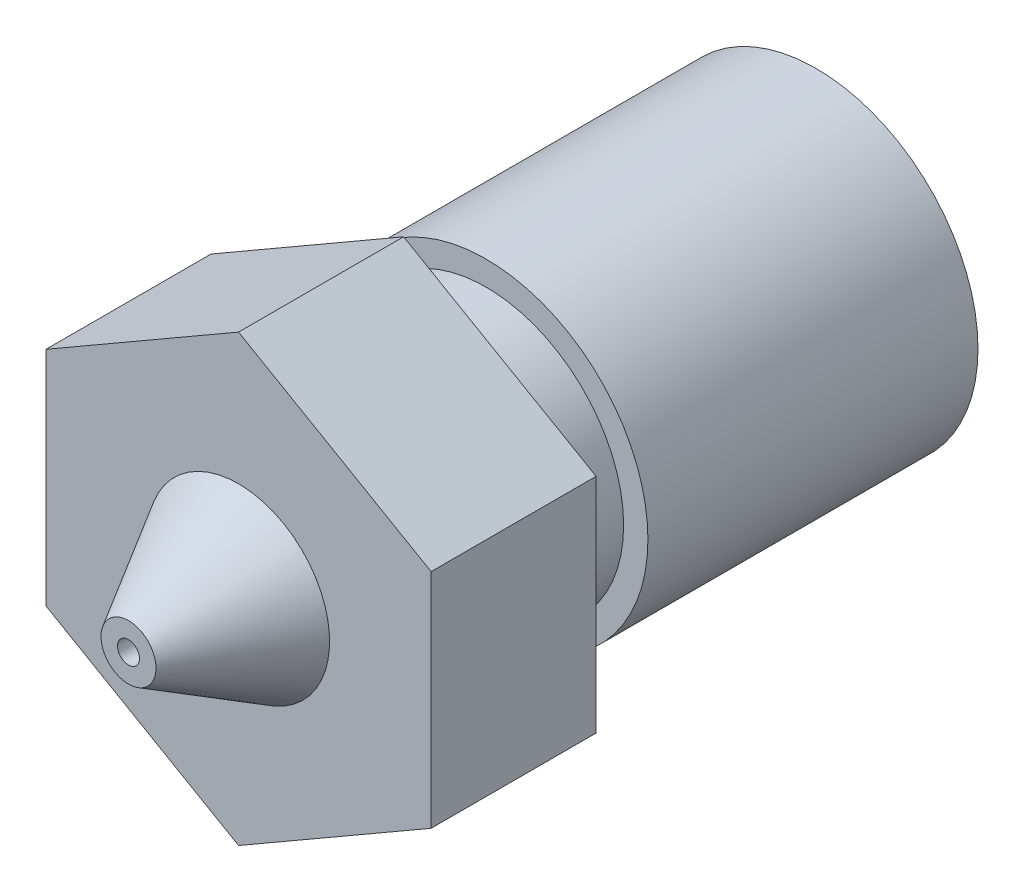
ISO-10303-21;
HEADER;
FILE_DESCRIPTION(('STEP AP214'),'2;1');
FILE_NAME('part.step','',(''),(''),'','','');
FILE_SCHEMA(('AUTOMOTIVE_DESIGN { 1 0 10303 214 1 1 1 1 }'));
ENDSEC;
DATA;
#1=APPLICATION_CONTEXT('core data for automotive mechanical design processes');
#2=APPLICATION_PROTOCOL_DEFINITION('international standard','automotive_design',2000,#1);
#3=PRODUCT_CONTEXT('',#1,'mechanical');
#4=PRODUCT('Part','Part','',(#3));
#5=PRODUCT_RELATED_PRODUCT_CATEGORY('part','',(#4));
#6=PRODUCT_DEFINITION_FORMATION('','',#4);
#7=PRODUCT_DEFINITION_CONTEXT('part definition',#1,'design');
#8=PRODUCT_DEFINITION('design','',#6,#7);
#9=PRODUCT_DEFINITION_SHAPE('','',#8);
#10=(LENGTH_UNIT() NAMED_UNIT(*) SI_UNIT(.MILLI.,.METRE.));
#11=(NAMED_UNIT(*) PLANE_ANGLE_UNIT() SI_UNIT($,.RADIAN.));
#12=(NAMED_UNIT(*) SI_UNIT($,.STERADIAN.) SOLID_ANGLE_UNIT());
#13=UNCERTAINTY_MEASURE_WITH_UNIT(LENGTH_MEASURE(1.E-05),#10,'distance_accuracy_value','');
#14=(GEOMETRIC_REPRESENTATION_CONTEXT(3) GLOBAL_UNCERTAINTY_ASSIGNED_CONTEXT((#13)) GLOBAL_UNIT_ASSIGNED_CONTEXT((#10,
#11,#12)) REPRESENTATION_CONTEXT('',''));
#15=CARTESIAN_POINT('',(0.,0.,0.));
#16=DIRECTION('',(0.,0.,1.));
#17=DIRECTION('',(1.,0.,0.));
#18=AXIS2_PLACEMENT_3D('',#15,#16,#17);
#19=CARTESIAN_POINT('',(0.,0.,10.4999999999791));
#20=DIRECTION('',(0.,0.,-1.));
#21=DIRECTION('',(-1.,0.,0.));
#22=AXIS2_PLACEMENT_3D('',#19,#20,#21);
#23=CONICAL_SURFACE('',#22,1.65470053838135,0.523598775589144);
#24=CARTESIAN_POINT('',(0.,0.,12.5000000000455));
#25=DIRECTION('',(0.,0.,-1.));
#26=DIRECTION('',(-1.,0.,0.));
#27=AXIS2_PLACEMENT_3D('',#24,#25,#26);
#28=CIRCLE('',#27,0.499999999988176);
#29=CARTESIAN_POINT('',(-0.499999999988176,0.,12.5000000000455));
#30=VERTEX_POINT('',#29);
#31=EDGE_CURVE('E20',#30,#30,#28,.F.);
#32=CARTESIAN_POINT('',(0.,0.,10.4999999999791));
#33=DIRECTION('',(0.,0.,-1.));
#34=DIRECTION('',(-1.,0.,0.));
#35=AXIS2_PLACEMENT_3D('',#32,#33,#34);
#36=CIRCLE('',#35,1.65470053838135);
#37=CARTESIAN_POINT('',(-1.65470053838135,0.,10.4999999999791));
#38=VERTEX_POINT('',#37);
#39=EDGE_CURVE('E114',#38,#38,#36,.T.);
#40=CARTESIAN_POINT('',(-0.499999999988176,0.,12.5000000000455));
#41=CARTESIAN_POINT('',(-0.512028130596438,0.,12.4791666667114));
#42=CARTESIAN_POINT('',(-0.5240562612047,0.,12.4583333333774));
#43=CARTESIAN_POINT('',(-0.548112522421225,0.,12.4166666667094));
#44=CARTESIAN_POINT('',(-0.560140653029487,0.,12.3958333333754));
#45=CARTESIAN_POINT('',(-0.584196914246011,0.,12.3541666667073));
#46=CARTESIAN_POINT('',(-0.596225044854274,0.,12.3333333333733));
#47=CARTESIAN_POINT('',(-0.620281306070798,0.,12.2916666667052));
#48=CARTESIAN_POINT('',(-0.63230943667906,0.,12.2708333333712));
#49=CARTESIAN_POINT('',(-0.656365697895585,0.,12.2291666667032));
#50=CARTESIAN_POINT('',(-0.668393828503847,0.,12.2083333333691));
#51=CARTESIAN_POINT('',(-0.692450089720371,0.,12.1666666667011));
#52=CARTESIAN_POINT('',(-0.704478220328633,0.,12.1458333333671));
#53=CARTESIAN_POINT('',(-0.728534481545158,0.,12.104166666699));
#54=CARTESIAN_POINT('',(-0.74056261215342,0.,12.083333333365));
#55=CARTESIAN_POINT('',(-0.764618873369945,0.,12.0416666666969));
#56=CARTESIAN_POINT('',(-0.776647003978207,0.,12.0208333333629));
#57=CARTESIAN_POINT('',(-0.800703265194731,0.,11.9791666666949));
#58=CARTESIAN_POINT('',(-0.812731395802993,0.,11.9583333333608));
#59=CARTESIAN_POINT('',(-0.836787657019518,0.,11.9166666666928));
#60=CARTESIAN_POINT('',(-0.84881578762778,0.,11.8958333333588));
#61=CARTESIAN_POINT('',(-0.872872048844304,0.,11.8541666666907));
#62=CARTESIAN_POINT('',(-0.884900179452567,0.,11.8333333333567));
#63=CARTESIAN_POINT('',(-0.908956440669091,0.,11.7916666666886));
#64=CARTESIAN_POINT('',(-0.920984571277353,0.,11.7708333333546));
#65=CARTESIAN_POINT('',(-0.945040832493878,0.,11.7291666666866));
#66=CARTESIAN_POINT('',(-0.95706896310214,0.,11.7083333333525));
#67=CARTESIAN_POINT('',(-0.981125224318664,0.,11.6666666666845));
#68=CARTESIAN_POINT('',(-0.993153354926927,0.,11.6458333333505));
#69=CARTESIAN_POINT('',(-1.01720961614345,0.,11.6041666666824));
#70=CARTESIAN_POINT('',(-1.02923774675171,0.,11.5833333333484));
#71=CARTESIAN_POINT('',(-1.05329400796824,0.,11.5416666666803));
#72=CARTESIAN_POINT('',(-1.0653221385765,0.,11.5208333333463));
#73=CARTESIAN_POINT('',(-1.08937839979302,0.,11.4791666666783));
#74=CARTESIAN_POINT('',(-1.10140653040129,0.,11.4583333333442));
#75=CARTESIAN_POINT('',(-1.12546279161781,0.,11.4166666666762));
#76=CARTESIAN_POINT('',(-1.13749092222607,0.,11.3958333333422));
#77=CARTESIAN_POINT('',(-1.1615471834426,0.,11.3541666666741));
#78=CARTESIAN_POINT('',(-1.17357531405086,0.,11.3333333333401));
#79=CARTESIAN_POINT('',(-1.19763157526738,0.,11.291666666672));
#80=CARTESIAN_POINT('',(-1.20965970587565,0.,11.270833333338));
#81=CARTESIAN_POINT('',(-1.23371596709217,0.,11.22916666667));
#82=CARTESIAN_POINT('',(-1.24574409770043,0.,11.2083333333359));
#83=CARTESIAN_POINT('',(-1.26980035891696,0.,11.1666666666679));
#84=CARTESIAN_POINT('',(-1.28182848952522,0.,11.1458333333339));
#85=CARTESIAN_POINT('',(-1.30588475074174,0.,11.1041666666658));
#86=CARTESIAN_POINT('',(-1.31791288135001,0.,11.0833333333318));
#87=CARTESIAN_POINT('',(-1.34196914256653,0.,11.0416666666637));
#88=CARTESIAN_POINT('',(-1.35399727317479,0.,11.0208333333297));
#89=CARTESIAN_POINT('',(-1.37805353439132,0.,10.9791666666617));
#90=CARTESIAN_POINT('',(-1.39008166499958,0.,10.9583333333276));
#91=CARTESIAN_POINT('',(-1.4141379262161,0.,10.9166666666596));
#92=CARTESIAN_POINT('',(-1.42616605682437,0.,10.8958333333256));
#93=CARTESIAN_POINT('',(-1.45022231804089,0.,10.8541666666575));
#94=CARTESIAN_POINT('',(-1.46225044864915,0.,10.8333333333235));
#95=CARTESIAN_POINT('',(-1.48630670986568,0.,10.7916666666554));
#96=CARTESIAN_POINT('',(-1.49833484047394,0.,10.7708333333214));
#97=CARTESIAN_POINT('',(-1.52239110169046,0.,10.7291666666534));
#98=CARTESIAN_POINT('',(-1.53441923229873,0.,10.7083333333193));
#99=CARTESIAN_POINT('',(-1.55847549351525,0.,10.6666666666513));
#100=CARTESIAN_POINT('',(-1.57050362412351,0.,10.6458333333173));
#101=CARTESIAN_POINT('',(-1.59455988534004,0.,10.6041666666492));
#102=CARTESIAN_POINT('',(-1.6065880159483,0.,10.5833333333152));
#103=CARTESIAN_POINT('',(-1.63064427716482,0.,10.5416666666471));
#104=CARTESIAN_POINT('',(-1.64267240777309,0.,10.5208333333131));
#105=CARTESIAN_POINT('',(-1.65470053838135,0.,10.4999999999791));
#106=B_SPLINE_CURVE_WITH_KNOTS('',3,(#40,#41,#42,#43,#44,#45,#46,#47,#48,#49,#50,#51,#52,#53,
#54,#55,#56,#57,#58,#59,#60,#61,#62,#63,#64,#65,#66,#67,#68,#69,#70,#71,#72,#73,#74,#75,#76,#77,
#78,#79,#80,#81,#82,#83,#84,#85,#86,#87,#88,#89,#90,#91,#92,#93,#94,#95,#96,#97,#98,#99,#100,
#101,#102,#103,#104,#105),.UNSPECIFIED.,.F.,.F.,(4,2,2,2,2,2,2,2,2,2,2,2,2,2,2,2,2,2,2,2,2,2,2,
2,2,2,2,2,2,2,2,2,4),(0.,0.0721687836507175,0.144337567301435,0.216506350952153,
0.28867513460287,0.360843918253588,0.433012701904305,0.505181485555023,0.57735026920574,
0.649519052856458,0.721687836507175,0.793856620157893,0.86602540380861,0.938194187459328,
1.01036297111005,1.08253175476076,1.15470053841148,1.2268693220622,1.29903810571292,
1.37120688936363,1.44337567301435,1.51554445666507,1.58771324031579,1.6598820239665,
1.73205080761722,1.80421959126794,1.87638837491866,1.94855715856937,2.02072594222009,
2.09289472587081,2.16506350952153,2.23723229317224,2.30940107682296),.UNSPECIFIED.);
#107=EDGE_CURVE('BSEAM17',#30,#38,#106,.T.);
#108=ORIENTED_EDGE('',*,*,#31,.F.);
#109=ORIENTED_EDGE('',*,*,#39,.F.);
#110=ORIENTED_EDGE('',*,*,#107,.T.);
#111=ORIENTED_EDGE('',*,*,#107,.F.);
#112=EDGE_LOOP('',(#108,#110,#109,#111));
#113=FACE_BOUND('',#112,.T.);
#114=ADVANCED_FACE('F17',(#113),#23,.T.);
#115=CARTESIAN_POINT('',(0.,0.,12.5));
#116=DIRECTION('',(0.,0.,1.));
#117=DIRECTION('',(1.,0.,0.));
#118=AXIS2_PLACEMENT_3D('',#115,#116,#117);
#119=PLANE('',#118);
#120=CARTESIAN_POINT('',(0.,0.,12.5));
#121=DIRECTION('',(0.,0.,1.));
#122=DIRECTION('',(1.,0.,0.));
#123=AXIS2_PLACEMENT_3D('',#120,#121,#122);
#124=CIRCLE('',#123,0.2);
#125=CARTESIAN_POINT('',(0.2,0.,12.5));
#126=VERTEX_POINT('',#125);
#127=EDGE_CURVE('E78',#126,#126,#124,.F.);
#128=ORIENTED_EDGE('',*,*,#127,.T.);
#129=EDGE_LOOP('',(#128));
#130=FACE_BOUND('',#129,.T.);
#131=ORIENTED_EDGE('',*,*,#31,.T.);
#132=EDGE_LOOP('',(#131));
#133=FACE_BOUND('',#132,.T.);
#134=ADVANCED_FACE('F121',(#130,#133),#119,.T.);
#135=CARTESIAN_POINT('',(0.,0.,10.5));
#136=DIRECTION('',(0.,0.,1.));
#137=DIRECTION('',(1.,0.,0.));
#138=AXIS2_PLACEMENT_3D('',#135,#136,#137);
#139=PLANE('',#138);
#140=ORIENTED_EDGE('',*,*,#39,.T.);
#141=EDGE_LOOP('',(#140));
#142=FACE_BOUND('',#141,.T.);
#143=DIRECTION('',(0.,1.,0.));
#144=VECTOR('',#143,1.);
#145=CARTESIAN_POINT('',(3.5,-2.02072594216369,10.5));
#146=LINE('',#145,#144);
#147=CARTESIAN_POINT('',(3.5,2.02072594216369,10.5));
#148=VERTEX_POINT('',#147);
#149=CARTESIAN_POINT('',(3.5,-2.02072594216369,10.5));
#150=VERTEX_POINT('',#149);
#151=EDGE_CURVE('E310',#148,#150,#146,.F.);
#152=ORIENTED_EDGE('',*,*,#151,.F.);
#153=DIRECTION('',(-0.866025403784438,0.500000000000001,0.));
#154=VECTOR('',#153,1.);
#155=CARTESIAN_POINT('',(3.5,2.02072594216369,10.5));
#156=LINE('',#155,#154);
#157=CARTESIAN_POINT('',(0.,4.04145188432738,10.5));
#158=VERTEX_POINT('',#157);
#159=EDGE_CURVE('E315',#158,#148,#156,.F.);
#160=ORIENTED_EDGE('',*,*,#159,.F.);
#161=DIRECTION('',(-0.866025403784439,-0.499999999999999,0.));
#162=VECTOR('',#161,1.);
#163=CARTESIAN_POINT('',(0.,4.04145188432738,10.5));
#164=LINE('',#163,#162);
#165=CARTESIAN_POINT('',(-3.5,2.02072594216369,10.5));
#166=VERTEX_POINT('',#165);
#167=EDGE_CURVE('E75',#166,#158,#164,.F.);
#168=ORIENTED_EDGE('',*,*,#167,.F.);
#169=DIRECTION('',(0.,-1.,0.));
#170=VECTOR('',#169,1.);
#171=CARTESIAN_POINT('',(-3.5,2.02072594216369,10.5));
#172=LINE('',#171,#170);
#173=CARTESIAN_POINT('',(-3.5,-2.02072594216369,10.5));
#174=VERTEX_POINT('',#173);
#175=EDGE_CURVE('E71',#174,#166,#172,.F.);
#176=ORIENTED_EDGE('',*,*,#175,.F.);
#177=DIRECTION('',(0.866025403784438,-0.5,0.));
#178=VECTOR('',#177,1.);
#179=CARTESIAN_POINT('',(-3.5,-2.02072594216369,10.5));
#180=LINE('',#179,#178);
#181=CARTESIAN_POINT('',(0.,-4.04145188432738,10.5));
#182=VERTEX_POINT('',#181);
#183=EDGE_CURVE('E68',#182,#174,#180,.F.);
#184=ORIENTED_EDGE('',*,*,#183,.F.);
#185=DIRECTION('',(0.866025403784439,0.5,0.));
#186=VECTOR('',#185,1.);
#187=CARTESIAN_POINT('',(0.,-4.04145188432738,10.5));
#188=LINE('',#187,#186);
#189=EDGE_CURVE('E87',#150,#182,#188,.F.);
#190=ORIENTED_EDGE('',*,*,#189,.F.);
#191=EDGE_LOOP('',(#152,#160,#168,#176,#184,#190));
#192=FACE_BOUND('',#191,.T.);
#193=ADVANCED_FACE('F73',(#142,#192),#139,.T.);
#194=CARTESIAN_POINT('',(0.,0.,0.));
#195=DIRECTION('',(0.,0.,1.));
#196=DIRECTION('',(1.,0.,0.));
#197=AXIS2_PLACEMENT_3D('',#194,#195,#196);
#198=CYLINDRICAL_SURFACE('',#197,0.2);
#199=CARTESIAN_POINT('',(0.,0.,11.9000000000256));
#200=DIRECTION('',(0.,0.,-1.));
#201=DIRECTION('',(0.,1.,0.));
#202=AXIS2_PLACEMENT_3D('',#199,#200,#201);
#203=CIRCLE('',#202,0.20000000000664);
#204=CARTESIAN_POINT('',(-0.199999999991409,0.,11.9000000000256));
#205=VERTEX_POINT('',#204);
#206=EDGE_CURVE('E96',#205,#205,#203,.T.);
#207=ORIENTED_EDGE('',*,*,#206,.T.);
#208=EDGE_LOOP('',(#207));
#209=FACE_BOUND('',#208,.T.);
#210=ORIENTED_EDGE('',*,*,#127,.F.);
#211=EDGE_LOOP('',(#210));
#212=FACE_BOUND('',#211,.T.);
#213=ADVANCED_FACE('F185',(#209,#212),#198,.F.);
#214=CARTESIAN_POINT('',(-3.5,2.02072594216369,7.5));
#215=DIRECTION('',(-1.,0.,0.));
#216=DIRECTION('',(0.,-1.,0.));
#217=AXIS2_PLACEMENT_3D('',#214,#215,#216);
#218=PLANE('',#217);
#219=ORIENTED_EDGE('',*,*,#175,.T.);
#220=DIRECTION('',(0.,0.,1.));
#221=VECTOR('',#220,1.);
#222=CARTESIAN_POINT('',(-3.5,2.02072594216369,7.5));
#223=LINE('',#222,#221);
#224=CARTESIAN_POINT('',(-3.5,2.02072594216369,7.5));
#225=VERTEX_POINT('',#224);
#226=EDGE_CURVE('E320',#225,#166,#223,.T.);
#227=ORIENTED_EDGE('',*,*,#226,.F.);
#228=DIRECTION('',(0.,1.,0.));
#229=VECTOR('',#228,1.);
#230=CARTESIAN_POINT('',(-3.5,0.,7.5));
#231=LINE('',#230,#229);
#232=CARTESIAN_POINT('',(-3.5,-2.02072594216369,7.5));
#233=VERTEX_POINT('',#232);
#234=EDGE_CURVE('E84',#225,#233,#231,.F.);
#235=ORIENTED_EDGE('',*,*,#234,.T.);
#236=DIRECTION('',(0.,0.,1.));
#237=VECTOR('',#236,1.);
#238=CARTESIAN_POINT('',(-3.5,-2.02072594216369,7.5));
#239=LINE('',#238,#237);
#240=EDGE_CURVE('E81',#174,#233,#239,.F.);
#241=ORIENTED_EDGE('',*,*,#240,.F.);
#242=EDGE_LOOP('',(#219,#227,#235,#241));
#243=FACE_BOUND('',#242,.T.);
#244=ADVANCED_FACE('F82',(#243),#218,.T.);
#245=CARTESIAN_POINT('',(-3.5,-2.02072594216369,7.5));
#246=DIRECTION('',(-0.5,-0.866025403784438,0.));
#247=DIRECTION('',(0.866025403784438,-0.5,0.));
#248=AXIS2_PLACEMENT_3D('',#245,#246,#247);
#249=PLANE('',#248);
#250=ORIENTED_EDGE('',*,*,#183,.T.);
#251=ORIENTED_EDGE('',*,*,#240,.T.);
#252=DIRECTION('',(0.866025403784438,-0.5,0.));
#253=VECTOR('',#252,1.);
#254=CARTESIAN_POINT('',(-3.5,-2.02072594216369,7.5));
#255=LINE('',#254,#253);
#256=CARTESIAN_POINT('',(0.,-4.04145188432738,7.5));
#257=VERTEX_POINT('',#256);
#258=EDGE_CURVE('E325',#233,#257,#255,.T.);
#259=ORIENTED_EDGE('',*,*,#258,.T.);
#260=DIRECTION('',(0.,0.,1.));
#261=VECTOR('',#260,1.);
#262=CARTESIAN_POINT('',(0.,-4.04145188432738,7.5));
#263=LINE('',#262,#261);
#264=EDGE_CURVE('E91',#182,#257,#263,.F.);
#265=ORIENTED_EDGE('',*,*,#264,.F.);
#266=EDGE_LOOP('',(#250,#251,#259,#265));
#267=FACE_BOUND('',#266,.T.);
#268=ADVANCED_FACE('F89',(#267),#249,.T.);
#269=CARTESIAN_POINT('',(0.,-4.04145188432738,7.5));
#270=DIRECTION('',(0.5,-0.866025403784439,0.));
#271=DIRECTION('',(0.866025403784439,0.5,0.));
#272=AXIS2_PLACEMENT_3D('',#269,#270,#271);
#273=PLANE('',#272);
#274=ORIENTED_EDGE('',*,*,#189,.T.);
#275=ORIENTED_EDGE('',*,*,#264,.T.);
#276=DIRECTION('',(0.866025403784439,0.5,0.));
#277=VECTOR('',#276,1.);
#278=CARTESIAN_POINT('',(0.,-4.04145188432738,7.5));
#279=LINE('',#278,#277);
#280=CARTESIAN_POINT('',(3.5,-2.02072594216369,7.5));
#281=VERTEX_POINT('',#280);
#282=EDGE_CURVE('E327',#257,#281,#279,.T.);
#283=ORIENTED_EDGE('',*,*,#282,.T.);
#284=DIRECTION('',(0.,0.,1.));
#285=VECTOR('',#284,1.);
#286=CARTESIAN_POINT('',(3.5,-2.02072594216369,7.5));
#287=LINE('',#286,#285);
#288=EDGE_CURVE('E308',#150,#281,#287,.F.);
#289=ORIENTED_EDGE('',*,*,#288,.F.);
#290=EDGE_LOOP('',(#274,#275,#283,#289));
#291=FACE_BOUND('',#290,.T.);
#292=ADVANCED_FACE('F176',(#291),#273,.T.);
#293=CARTESIAN_POINT('',(3.5,-2.02072594216369,7.5));
#294=DIRECTION('',(1.,0.,0.));
#295=DIRECTION('',(0.,1.,0.));
#296=AXIS2_PLACEMENT_3D('',#293,#294,#295);
#297=PLANE('',#296);
#298=ORIENTED_EDGE('',*,*,#151,.T.);
#299=ORIENTED_EDGE('',*,*,#288,.T.);
#300=DIRECTION('',(0.,1.,0.));
#301=VECTOR('',#300,1.);
#302=CARTESIAN_POINT('',(3.5,0.,7.5));
#303=LINE('',#302,#301);
#304=CARTESIAN_POINT('',(3.5,2.02072594216369,7.5));
#305=VERTEX_POINT('',#304);
#306=EDGE_CURVE('E329',#281,#305,#303,.T.);
#307=ORIENTED_EDGE('',*,*,#306,.T.);
#308=DIRECTION('',(0.,0.,1.));
#309=VECTOR('',#308,1.);
#310=CARTESIAN_POINT('',(3.5,2.02072594216369,7.5));
#311=LINE('',#310,#309);
#312=EDGE_CURVE('E318',#148,#305,#311,.F.);
#313=ORIENTED_EDGE('',*,*,#312,.F.);
#314=EDGE_LOOP('',(#298,#299,#307,#313));
#315=FACE_BOUND('',#314,.T.);
#316=ADVANCED_FACE('F173',(#315),#297,.T.);
#317=CARTESIAN_POINT('',(3.5,2.02072594216369,7.5));
#318=DIRECTION('',(0.500000000000001,0.866025403784438,0.));
#319=DIRECTION('',(-0.866025403784438,0.500000000000001,0.));
#320=AXIS2_PLACEMENT_3D('',#317,#318,#319);
#321=PLANE('',#320);
#322=ORIENTED_EDGE('',*,*,#159,.T.);
#323=ORIENTED_EDGE('',*,*,#312,.T.);
#324=DIRECTION('',(-0.866025403784438,0.5,0.));
#325=VECTOR('',#324,1.);
#326=CARTESIAN_POINT('',(3.5,2.02072594216369,7.5));
#327=LINE('',#326,#325);
#328=CARTESIAN_POINT('',(0.,4.04145188432738,7.5));
#329=VERTEX_POINT('',#328);
#330=EDGE_CURVE('E35',#305,#329,#327,.T.);
#331=ORIENTED_EDGE('',*,*,#330,.T.);
#332=DIRECTION('',(0.,0.,1.));
#333=VECTOR('',#332,1.);
#334=CARTESIAN_POINT('',(0.,4.04145188432738,7.5));
#335=LINE('',#334,#333);
#336=EDGE_CURVE('E98',#158,#329,#335,.F.);
#337=ORIENTED_EDGE('',*,*,#336,.F.);
#338=EDGE_LOOP('',(#322,#323,#331,#337));
#339=FACE_BOUND('',#338,.T.);
#340=ADVANCED_FACE('F169',(#339),#321,.T.);
#341=CARTESIAN_POINT('',(0.,4.04145188432738,7.5));
#342=DIRECTION('',(-0.499999999999999,0.866025403784439,0.));
#343=DIRECTION('',(-0.866025403784439,-0.499999999999999,0.));
#344=AXIS2_PLACEMENT_3D('',#341,#342,#343);
#345=PLANE('',#344);
#346=ORIENTED_EDGE('',*,*,#167,.T.);
#347=ORIENTED_EDGE('',*,*,#336,.T.);
#348=DIRECTION('',(-0.866025403784439,-0.5,0.));
#349=VECTOR('',#348,1.);
#350=CARTESIAN_POINT('',(0.,4.04145188432738,7.5));
#351=LINE('',#350,#349);
#352=EDGE_CURVE('E332',#329,#225,#351,.T.);
#353=ORIENTED_EDGE('',*,*,#352,.T.);
#354=ORIENTED_EDGE('',*,*,#226,.T.);
#355=EDGE_LOOP('',(#346,#347,#353,#354));
#356=FACE_BOUND('',#355,.T.);
#357=ADVANCED_FACE('F165',(#356),#345,.T.);
#358=CARTESIAN_POINT('',(0.,0.,10.5143593540902));
#359=DIRECTION('',(0.,0.,-1.));
#360=DIRECTION('',(-1.,0.,0.));
#361=AXIS2_PLACEMENT_3D('',#358,#359,#360);
#362=CONICAL_SURFACE('',#361,0.999999999919511,0.523598775596795);
#363=CARTESIAN_POINT('',(0.,0.,10.5143593539449));
#364=DIRECTION('',(0.,0.,-1.));
#365=DIRECTION('',(-1.,0.,0.));
#366=AXIS2_PLACEMENT_3D('',#363,#364,#365);
#367=CIRCLE('',#366,1.);
#368=CARTESIAN_POINT('',(-1.00000000000338,0.,10.5143593539449));
#369=VERTEX_POINT('',#368);
#370=EDGE_CURVE('E112',#369,#369,#367,.T.);
#371=CARTESIAN_POINT('',(-1.00000000000338,0.,10.5143593539449));
#372=CARTESIAN_POINT('',(-0.991666666669927,0.,10.5287931106749));
#373=CARTESIAN_POINT('',(-0.983333333336468,0.,10.5432268674049));
#374=CARTESIAN_POINT('',(-0.966666666669552,0.,10.5720943808649));
#375=CARTESIAN_POINT('',(-0.958333333336094,0.,10.5865281375949));
#376=CARTESIAN_POINT('',(-0.941666666669178,0.,10.6153956510549));
#377=CARTESIAN_POINT('',(-0.93333333333572,0.,10.629829407785));
#378=CARTESIAN_POINT('',(-0.916666666668804,0.,10.658696921245));
#379=CARTESIAN_POINT('',(-0.908333333335346,0.,10.673130677975));
#380=CARTESIAN_POINT('',(-0.89166666666843,0.,10.701998191435));
#381=CARTESIAN_POINT('',(-0.883333333334971,0.,10.716431948165));
#382=CARTESIAN_POINT('',(-0.866666666668055,0.,10.745299461625));
#383=CARTESIAN_POINT('',(-0.858333333334597,0.,10.759733218355));
#384=CARTESIAN_POINT('',(-0.841666666667681,0.,10.788600731815));
#385=CARTESIAN_POINT('',(-0.833333333334223,0.,10.803034488545));
#386=CARTESIAN_POINT('',(-0.816666666667307,0.,10.8319020020051));
#387=CARTESIAN_POINT('',(-0.808333333333849,0.,10.8463357587351));
#388=CARTESIAN_POINT('',(-0.791666666666933,0.,10.8752032721951));
#389=CARTESIAN_POINT('',(-0.783333333333474,0.,10.8896370289251));
#390=CARTESIAN_POINT('',(-0.766666666666558,0.,10.9185045423851));
#391=CARTESIAN_POINT('',(-0.7583333333331,0.,10.9329382991151));
#392=CARTESIAN_POINT('',(-0.741666666666184,0.,10.9618058125751));
#393=CARTESIAN_POINT('',(-0.733333333332726,0.,10.9762395693051));
#394=CARTESIAN_POINT('',(-0.71666666666581,0.,11.0051070827651));
#395=CARTESIAN_POINT('',(-0.708333333332352,0.,11.0195408394951));
#396=CARTESIAN_POINT('',(-0.691666666665436,0.,11.0484083529552));
#397=CARTESIAN_POINT('',(-0.683333333331978,0.,11.0628421096852));
#398=CARTESIAN_POINT('',(-0.666666666665061,0.,11.0917096231452));
#399=CARTESIAN_POINT('',(-0.658333333331603,0.,11.1061433798752));
#400=CARTESIAN_POINT('',(-0.641666666664687,0.,11.1350108933352));
#401=CARTESIAN_POINT('',(-0.633333333331229,0.,11.1494446500652));
#402=CARTESIAN_POINT('',(-0.616666666664313,0.,11.1783121635252));
#403=CARTESIAN_POINT('',(-0.608333333330855,0.,11.1927459202552));
#404=CARTESIAN_POINT('',(-0.591666666663939,0.,11.2216134337152));
#405=CARTESIAN_POINT('',(-0.583333333330481,0.,11.2360471904452));
#406=CARTESIAN_POINT('',(-0.566666666663564,0.,11.2649147039053));
#407=CARTESIAN_POINT('',(-0.558333333330106,0.,11.2793484606353));
#408=CARTESIAN_POINT('',(-0.54166666666319,0.,11.3082159740953));
#409=CARTESIAN_POINT('',(-0.533333333329732,0.,11.3226497308253));
#410=CARTESIAN_POINT('',(-0.516666666662816,0.,11.3515172442853));
#411=CARTESIAN_POINT('',(-0.508333333329358,0.,11.3659510010153));
#412=CARTESIAN_POINT('',(-0.491666666662442,0.,11.3948185144753));
#413=CARTESIAN_POINT('',(-0.483333333328984,0.,11.4092522712053));
#414=CARTESIAN_POINT('',(-0.466666666662067,0.,11.4381197846653));
#415=CARTESIAN_POINT('',(-0.458333333328609,0.,11.4525535413953));
#416=CARTESIAN_POINT('',(-0.441666666661693,0.,11.4814210548554));
#417=CARTESIAN_POINT('',(-0.433333333328235,0.,11.4958548115854));
#418=CARTESIAN_POINT('',(-0.416666666661319,0.,11.5247223250454));
#419=CARTESIAN_POINT('',(-0.408333333327861,0.,11.5391560817754));
#420=CARTESIAN_POINT('',(-0.391666666660945,0.,11.5680235952354));
#421=CARTESIAN_POINT('',(-0.383333333327487,0.,11.5824573519654));
#422=CARTESIAN_POINT('',(-0.36666666666057,0.,11.6113248654254));
#423=CARTESIAN_POINT('',(-0.358333333327112,0.,11.6257586221554));
#424=CARTESIAN_POINT('',(-0.341666666660196,0.,11.6546261356154));
#425=CARTESIAN_POINT('',(-0.333333333326738,0.,11.6690598923454));
#426=CARTESIAN_POINT('',(-0.316666666659822,0.,11.6979274058055));
#427=CARTESIAN_POINT('',(-0.308333333326364,0.,11.7123611625355));
#428=CARTESIAN_POINT('',(-0.291666666659448,0.,11.7412286759955));
#429=CARTESIAN_POINT('',(-0.28333333332599,0.,11.7556624327255));
#430=CARTESIAN_POINT('',(-0.266666666659073,0.,11.7845299461855));
#431=CARTESIAN_POINT('',(-0.258333333325615,0.,11.7989637029155));
#432=CARTESIAN_POINT('',(-0.241666666658699,0.,11.8278312163755));
#433=CARTESIAN_POINT('',(-0.233333333325241,0.,11.8422649731055));
#434=CARTESIAN_POINT('',(-0.216666666658325,0.,11.8711324865655));
#435=CARTESIAN_POINT('',(-0.208333333324867,0.,11.8855662432955));
#436=CARTESIAN_POINT('',(-0.199999999991409,0.,11.9000000000256));
#437=B_SPLINE_CURVE_WITH_KNOTS('',3,(#371,#372,#373,#374,#375,#376,#377,#378,#379,#380,#381,
#382,#383,#384,#385,#386,#387,#388,#389,#390,#391,#392,#393,#394,#395,#396,#397,#398,#399,#400,
#401,#402,#403,#404,#405,#406,#407,#408,#409,#410,#411,#412,#413,#414,#415,#416,#417,#418,#419,
#420,#421,#422,#423,#424,#425,#426,#427,#428,#429,#430,#431,#432,#433,#434,#435,#436),
.UNSPECIFIED.,.F.,.F.,(4,2,2,2,2,2,2,2,2,2,2,2,2,2,2,2,2,2,2,2,2,2,2,2,2,2,2,2,2,2,2,2,4),(0.,
0.0500000000008787,0.100000000001757,0.150000000002636,0.200000000003515,0.250000000004393,
0.300000000005272,0.350000000006151,0.400000000007029,0.450000000007908,0.500000000008787,
0.550000000009665,0.600000000010544,0.650000000011422,0.700000000012301,0.75000000001318,
0.800000000014059,0.850000000014937,0.900000000015816,0.950000000016695,1.00000000001757,
1.05000000001845,1.10000000001933,1.15000000002021,1.20000000002109,1.25000000002197,
1.30000000002284,1.35000000002372,1.4000000000246,1.45000000002548,1.50000000002636,
1.55000000002724,1.60000000002812),.UNSPECIFIED.);
#438=EDGE_CURVE('BSEAM161',#369,#205,#437,.T.);
#439=ORIENTED_EDGE('',*,*,#370,.T.);
#440=ORIENTED_EDGE('',*,*,#206,.F.);
#441=ORIENTED_EDGE('',*,*,#438,.T.);
#442=ORIENTED_EDGE('',*,*,#438,.F.);
#443=EDGE_LOOP('',(#439,#441,#440,#442));
#444=FACE_BOUND('',#443,.T.);
#445=ADVANCED_FACE('F161',(#444),#362,.F.);
#446=CARTESIAN_POINT('',(0.,0.,7.5));
#447=DIRECTION('',(0.,0.,1.));
#448=DIRECTION('',(1.,0.,0.));
#449=AXIS2_PLACEMENT_3D('',#446,#447,#448);
#450=PLANE('',#449);
#451=CARTESIAN_POINT('',(0.,0.,7.5));
#452=DIRECTION('',(0.,0.,1.));
#453=DIRECTION('',(1.,0.,0.));
#454=AXIS2_PLACEMENT_3D('',#451,#452,#453);
#455=CIRCLE('',#454,2.5);
#456=CARTESIAN_POINT('',(2.5,0.,7.5));
#457=VERTEX_POINT('',#456);
#458=EDGE_CURVE('E109',#457,#457,#455,.F.);
#459=ORIENTED_EDGE('',*,*,#458,.F.);
#460=EDGE_LOOP('',(#459));
#461=FACE_BOUND('',#460,.T.);
#462=ORIENTED_EDGE('',*,*,#330,.F.);
#463=ORIENTED_EDGE('',*,*,#306,.F.);
#464=ORIENTED_EDGE('',*,*,#282,.F.);
#465=ORIENTED_EDGE('',*,*,#258,.F.);
#466=ORIENTED_EDGE('',*,*,#234,.F.);
#467=ORIENTED_EDGE('',*,*,#352,.F.);
#468=EDGE_LOOP('',(#462,#463,#464,#465,#466,#467));
#469=FACE_BOUND('',#468,.T.);
#470=ADVANCED_FACE('F157',(#461,#469),#450,.F.);
#471=CARTESIAN_POINT('',(0.,0.,5.25717967697245));
#472=DIRECTION('',(0.,0.,-1.));
#473=DIRECTION('',(-1.,0.,0.));
#474=AXIS2_PLACEMENT_3D('',#471,#472,#473);
#475=CYLINDRICAL_SURFACE('',#474,1.);
#476=CARTESIAN_POINT('',(0.,0.,0.519615242296823));
#477=DIRECTION('',(0.,0.,-1.));
#478=DIRECTION('',(0.,-1.,0.));
#479=AXIS2_PLACEMENT_3D('',#476,#477,#478);
#480=CIRCLE('',#479,0.999999999976352);
#481=CARTESIAN_POINT('',(0.,-0.999999999976353,0.519615242296823));
#482=VERTEX_POINT('',#481);
#483=EDGE_CURVE('E108',#482,#482,#480,.T.);
#484=ORIENTED_EDGE('',*,*,#483,.T.);
#485=EDGE_LOOP('',(#484));
#486=FACE_BOUND('',#485,.T.);
#487=ORIENTED_EDGE('',*,*,#370,.F.);
#488=EDGE_LOOP('',(#487));
#489=FACE_BOUND('',#488,.T.);
#490=ADVANCED_FACE('F153',(#486,#489),#475,.F.);
#491=CARTESIAN_POINT('',(0.,0.,0.));
#492=DIRECTION('',(0.,0.,1.));
#493=DIRECTION('',(1.,0.,0.));
#494=AXIS2_PLACEMENT_3D('',#491,#492,#493);
#495=CYLINDRICAL_SURFACE('',#494,2.5);
#496=CARTESIAN_POINT('',(0.,0.,6.));
#497=DIRECTION('',(0.,0.,1.));
#498=DIRECTION('',(1.,0.,0.));
#499=AXIS2_PLACEMENT_3D('',#496,#497,#498);
#500=CIRCLE('',#499,2.5);
#501=CARTESIAN_POINT('',(2.5,0.,6.));
#502=VERTEX_POINT('',#501);
#503=EDGE_CURVE('E105',#502,#502,#500,.F.);
#504=ORIENTED_EDGE('',*,*,#503,.F.);
#505=EDGE_LOOP('',(#504));
#506=FACE_BOUND('',#505,.T.);
#507=ORIENTED_EDGE('',*,*,#458,.T.);
#508=EDGE_LOOP('',(#507));
#509=FACE_BOUND('',#508,.T.);
#510=ADVANCED_FACE('F149',(#506,#509),#495,.T.);
#511=CARTESIAN_POINT('',(0.,0.,-5.6843418860808E-11));
#512=DIRECTION('',(0.,0.,-1.));
#513=DIRECTION('',(-1.,0.,0.));
#514=AXIS2_PLACEMENT_3D('',#511,#512,#513);
#515=CONICAL_SURFACE('',#514,1.30000000001473,0.523598775584528);
#516=ORIENTED_EDGE('',*,*,#483,.F.);
#517=EDGE_LOOP('',(#516));
#518=FACE_BOUND('',#517,.T.);
#519=CARTESIAN_POINT('',(0.,0.,-5.6843418860808E-11));
#520=DIRECTION('',(0.,0.,-1.));
#521=DIRECTION('',(-1.,0.,0.));
#522=AXIS2_PLACEMENT_3D('',#519,#520,#521);
#523=CIRCLE('',#522,1.30000000001473);
#524=CARTESIAN_POINT('',(-1.30000000001473,0.,-5.6843418860808E-11));
#525=VERTEX_POINT('',#524);
#526=EDGE_CURVE('E102',#525,#525,#523,.T.);
#527=ORIENTED_EDGE('',*,*,#526,.T.);
#528=EDGE_LOOP('',(#527));
#529=FACE_BOUND('',#528,.T.);
#530=ADVANCED_FACE('F145',(#518,#529),#515,.F.);
#531=CARTESIAN_POINT('',(0.,0.,6.));
#532=DIRECTION('',(0.,0.,1.));
#533=DIRECTION('',(1.,0.,0.));
#534=AXIS2_PLACEMENT_3D('',#531,#532,#533);
#535=PLANE('',#534);
#536=ORIENTED_EDGE('',*,*,#503,.T.);
#537=EDGE_LOOP('',(#536));
#538=FACE_BOUND('',#537,.T.);
#539=CARTESIAN_POINT('',(0.,0.,6.));
#540=DIRECTION('',(0.,0.,1.));
#541=DIRECTION('',(1.,0.,0.));
#542=AXIS2_PLACEMENT_3D('',#539,#540,#541);
#543=CIRCLE('',#542,2.942);
#544=CARTESIAN_POINT('',(2.942,0.,6.));
#545=VERTEX_POINT('',#544);
#546=EDGE_CURVE('E26',#545,#545,#543,.F.);
#547=ORIENTED_EDGE('',*,*,#546,.F.);
#548=EDGE_LOOP('',(#547));
#549=FACE_BOUND('',#548,.T.);
#550=ADVANCED_FACE('F138',(#538,#549),#535,.T.);
#551=CARTESIAN_POINT('',(0.,0.,0.));
#552=DIRECTION('',(0.,0.,1.));
#553=DIRECTION('',(1.,0.,0.));
#554=AXIS2_PLACEMENT_3D('',#551,#552,#553);
#555=PLANE('',#554);
#556=ORIENTED_EDGE('',*,*,#526,.F.);
#557=EDGE_LOOP('',(#556));
#558=FACE_BOUND('',#557,.T.);
#559=CARTESIAN_POINT('',(0.,0.,0.));
#560=DIRECTION('',(0.,0.,1.));
#561=DIRECTION('',(1.,0.,0.));
#562=AXIS2_PLACEMENT_3D('',#559,#560,#561);
#563=CIRCLE('',#562,2.942);
#564=CARTESIAN_POINT('',(2.942,0.,0.));
#565=VERTEX_POINT('',#564);
#566=EDGE_CURVE('E11',#565,#565,#563,.T.);
#567=ORIENTED_EDGE('',*,*,#566,.F.);
#568=EDGE_LOOP('',(#567));
#569=FACE_BOUND('',#568,.T.);
#570=ADVANCED_FACE('F132',(#558,#569),#555,.F.);
#571=CARTESIAN_POINT('',(0.,0.,0.));
#572=DIRECTION('',(0.,0.,1.));
#573=DIRECTION('',(1.,0.,0.));
#574=AXIS2_PLACEMENT_3D('',#571,#572,#573);
#575=CYLINDRICAL_SURFACE('',#574,2.942);
#576=ORIENTED_EDGE('',*,*,#566,.T.);
#577=EDGE_LOOP('',(#576));
#578=FACE_BOUND('',#577,.T.);
#579=ORIENTED_EDGE('',*,*,#546,.T.);
#580=EDGE_LOOP('',(#579));
#581=FACE_BOUND('',#580,.T.);
#582=ADVANCED_FACE('F130',(#578,#581),#575,.T.);
#583=CLOSED_SHELL('',(#114,#134,#193,#213,#244,#268,#292,#316,#340,#357,#445,#470,#490,#510,
#530,#550,#570,#582));
#584=MANIFOLD_SOLID_BREP('B1',#583);
#585=ADVANCED_BREP_SHAPE_REPRESENTATION('',(#18,#584),#14);
#586=SHAPE_DEFINITION_REPRESENTATION(#9,#585);
ENDSEC;
END-ISO-10303-21;
